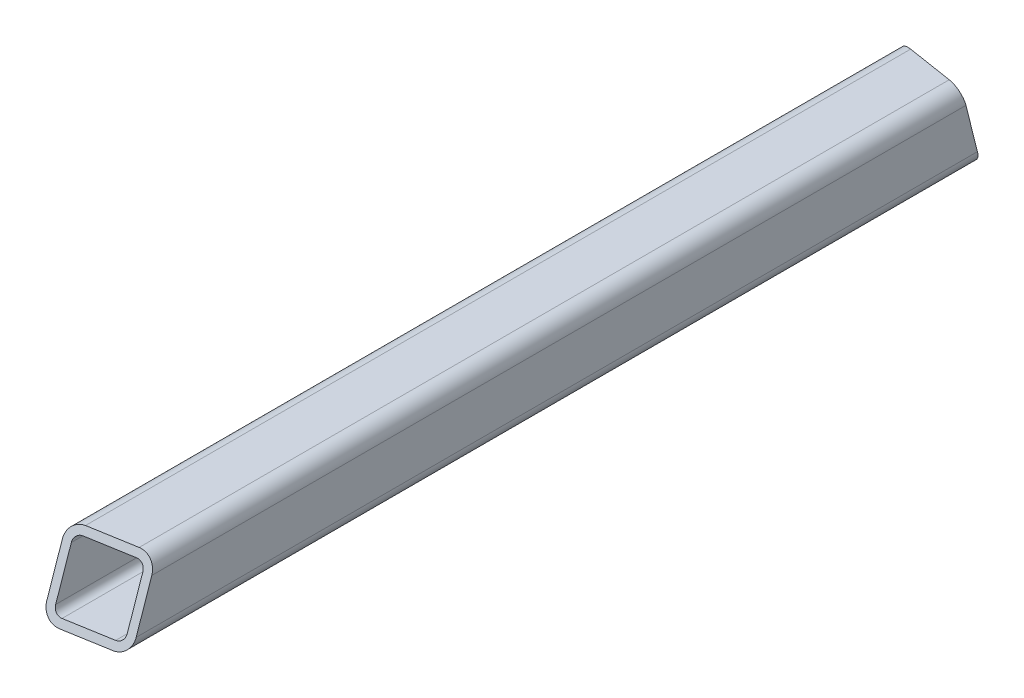
ISO-10303-21;
HEADER;
FILE_DESCRIPTION(('STEP AP214'),'2;1');
FILE_NAME('part.step','',(''),(''),'','','');
FILE_SCHEMA(('AUTOMOTIVE_DESIGN { 1 0 10303 214 1 1 1 1 }'));
ENDSEC;
DATA;
#1=APPLICATION_CONTEXT('core data for automotive mechanical design processes');
#2=APPLICATION_PROTOCOL_DEFINITION('international standard','automotive_design',2000,#1);
#3=PRODUCT_CONTEXT('',#1,'mechanical');
#4=PRODUCT('Part','Part','',(#3));
#5=PRODUCT_RELATED_PRODUCT_CATEGORY('part','',(#4));
#6=PRODUCT_DEFINITION_FORMATION('','',#4);
#7=PRODUCT_DEFINITION_CONTEXT('part definition',#1,'design');
#8=PRODUCT_DEFINITION('design','',#6,#7);
#9=PRODUCT_DEFINITION_SHAPE('','',#8);
#10=(LENGTH_UNIT() NAMED_UNIT(*) SI_UNIT(.MILLI.,.METRE.));
#11=(NAMED_UNIT(*) PLANE_ANGLE_UNIT() SI_UNIT($,.RADIAN.));
#12=(NAMED_UNIT(*) SI_UNIT($,.STERADIAN.) SOLID_ANGLE_UNIT());
#13=UNCERTAINTY_MEASURE_WITH_UNIT(LENGTH_MEASURE(1.E-05),#10,'distance_accuracy_value','');
#14=(GEOMETRIC_REPRESENTATION_CONTEXT(3) GLOBAL_UNCERTAINTY_ASSIGNED_CONTEXT((#13)) GLOBAL_UNIT_ASSIGNED_CONTEXT((#10,
#11,#12)) REPRESENTATION_CONTEXT('',''));
#15=CARTESIAN_POINT('',(0.,0.,0.));
#16=DIRECTION('',(0.,0.,1.));
#17=DIRECTION('',(1.,0.,0.));
#18=AXIS2_PLACEMENT_3D('',#15,#16,#17);
#19=CARTESIAN_POINT('',(115.999999999999,-74.0000000000005,-550.));
#20=DIRECTION('',(0.,0.,-1.));
#21=DIRECTION('',(0.,1.,0.));
#22=AXIS2_PLACEMENT_3D('',#19,#20,#21);
#23=CYLINDRICAL_SURFACE('',#22,4.);
#24=CARTESIAN_POINT('',(115.999999999999,-74.0000000000005,-767.542329532223));
#25=DIRECTION('',(0.151549664025947,0.241101738223099,-0.958594101358559));
#26=DIRECTION('',(-0.510136504157174,-0.811580802068235,-0.28477596253999));
#27=AXIS2_PLACEMENT_3D('',#24,#25,#26);
#28=ELLIPSE('',#27,4.17277760663355,4.);
#29=CARTESIAN_POINT('',(115.999999999999,-70.0000000000005,-766.536265598045));
#30=VERTEX_POINT('',#29);
#31=CARTESIAN_POINT('',(119.999999999999,-74.0000000000005,-766.909946487883));
#32=VERTEX_POINT('',#31);
#33=EDGE_CURVE('E185',#30,#32,#28,.T.);
#34=ORIENTED_EDGE('',*,*,#33,.F.);
#35=DIRECTION('',(0.,0.,-1.));
#36=VECTOR('',#35,1.);
#37=CARTESIAN_POINT('',(115.999999999999,-70.0000000000005,-550.));
#38=LINE('',#37,#36);
#39=CARTESIAN_POINT('',(115.999999999999,-70.0000000000005,-554.441330224498));
#40=VERTEX_POINT('',#39);
#41=EDGE_CURVE('E265',#40,#30,#38,.T.);
#42=ORIENTED_EDGE('',*,*,#41,.F.);
#43=CARTESIAN_POINT('',(115.999999999999,-74.0000000000005,-553.074767078499));
#44=DIRECTION('',(0.159575689721232,0.319151379442465,0.934172358962716));
#45=DIRECTION('',(0.417774579468393,0.835549158936787,-0.35682208977309));
#46=AXIS2_PLACEMENT_3D('',#43,#44,#45);
#47=ELLIPSE('',#46,4.28186507727708,4.);
#48=CARTESIAN_POINT('',(119.999999999999,-74.0000000000005,-553.758048651498));
#49=VERTEX_POINT('',#48);
#50=EDGE_CURVE('E176',#49,#40,#47,.T.);
#51=ORIENTED_EDGE('',*,*,#50,.F.);
#52=DIRECTION('',(0.,0.,-1.));
#53=VECTOR('',#52,1.);
#54=CARTESIAN_POINT('',(119.999999999999,-74.0000000000005,-550.));
#55=LINE('',#54,#53);
#56=EDGE_CURVE('E45',#49,#32,#55,.T.);
#57=ORIENTED_EDGE('',*,*,#56,.T.);
#58=EDGE_LOOP('',(#34,#42,#51,#57));
#59=FACE_BOUND('',#58,.T.);
#60=ADVANCED_FACE('F41',(#59),#23,.T.);
#61=CARTESIAN_POINT('',(115.999999999999,-70.0000000000005,-550.));
#62=DIRECTION('',(0.,-1.,0.));
#63=DIRECTION('',(0.,0.,-1.));
#64=AXIS2_PLACEMENT_3D('',#61,#62,#63);
#65=PLANE('',#64);
#66=DIRECTION('',(0.987732357643365,0.,0.156156298829986));
#67=VECTOR('',#66,1.);
#68=CARTESIAN_POINT('',(149.39868985137,-70.0000000000005,-761.256074306748));
#69=LINE('',#68,#67);
#70=CARTESIAN_POINT('',(103.999999999999,-70.0000000000005,-768.433414731066));
#71=VERTEX_POINT('',#70);
#72=EDGE_CURVE('E182',#71,#30,#69,.T.);
#73=ORIENTED_EDGE('',*,*,#72,.F.);
#74=DIRECTION('',(0.,0.,-1.));
#75=VECTOR('',#74,1.);
#76=CARTESIAN_POINT('',(103.999999999999,-70.0000000000005,-550.));
#77=LINE('',#76,#75);
#78=CARTESIAN_POINT('',(103.999999999999,-70.0000000000005,-552.391485505499));
#79=VERTEX_POINT('',#78);
#80=EDGE_CURVE('E263',#79,#71,#77,.T.);
#81=ORIENTED_EDGE('',*,*,#80,.F.);
#82=DIRECTION('',(-0.985721919281302,0.,0.168381405886714));
#83=VECTOR('',#82,1.);
#84=CARTESIAN_POINT('',(115.262840255941,-70.0000000000005,-554.31540830713));
#85=LINE('',#84,#83);
#86=EDGE_CURVE('E281',#40,#79,#85,.T.);
#87=ORIENTED_EDGE('',*,*,#86,.F.);
#88=ORIENTED_EDGE('',*,*,#41,.T.);
#89=EDGE_LOOP('',(#73,#81,#87,#88));
#90=FACE_BOUND('',#89,.T.);
#91=ADVANCED_FACE('F272',(#90),#65,.F.);
#92=CARTESIAN_POINT('',(103.999999999999,-74.0000000000005,-550.));
#93=DIRECTION('',(0.,0.,-1.));
#94=DIRECTION('',(0.,1.,0.));
#95=AXIS2_PLACEMENT_3D('',#92,#93,#94);
#96=CYLINDRICAL_SURFACE('',#95,4.);
#97=CARTESIAN_POINT('',(103.999999999999,-74.0000000000005,-769.439478665244));
#98=DIRECTION('',(0.151549664025947,0.241101738223099,-0.958594101358559));
#99=DIRECTION('',(-0.510136504157174,-0.811580802068235,-0.28477596253999));
#100=AXIS2_PLACEMENT_3D('',#97,#98,#99);
#101=ELLIPSE('',#100,4.17277760663355,4.);
#102=CARTESIAN_POINT('',(99.9999999999993,-74.0000000000005,-770.071861709584));
#103=VERTEX_POINT('',#102);
#104=EDGE_CURVE('E11',#103,#71,#101,.T.);
#105=ORIENTED_EDGE('',*,*,#104,.F.);
#106=DIRECTION('',(0.,0.,-1.));
#107=VECTOR('',#106,1.);
#108=CARTESIAN_POINT('',(99.9999999999993,-74.0000000000005,-550.));
#109=LINE('',#108,#107);
#110=CARTESIAN_POINT('',(99.9999999999993,-74.0000000000005,-550.3416407865));
#111=VERTEX_POINT('',#110);
#112=EDGE_CURVE('E260',#111,#103,#109,.T.);
#113=ORIENTED_EDGE('',*,*,#112,.F.);
#114=CARTESIAN_POINT('',(103.999999999999,-74.0000000000005,-551.024922359499));
#115=DIRECTION('',(0.159575689721232,0.319151379442465,0.934172358962716));
#116=DIRECTION('',(0.417774579468393,0.835549158936787,-0.35682208977309));
#117=AXIS2_PLACEMENT_3D('',#114,#115,#116);
#118=ELLIPSE('',#117,4.28186507727708,4.);
#119=EDGE_CURVE('E278',#79,#111,#118,.T.);
#120=ORIENTED_EDGE('',*,*,#119,.F.);
#121=ORIENTED_EDGE('',*,*,#80,.T.);
#122=EDGE_LOOP('',(#105,#113,#120,#121));
#123=FACE_BOUND('',#122,.T.);
#124=ADVANCED_FACE('F275',(#123),#96,.T.);
#125=CARTESIAN_POINT('',(99.9999999999993,-86.0000000000005,-550.));
#126=DIRECTION('',(1.,0.,0.));
#127=DIRECTION('',(0.,0.,-1.));
#128=AXIS2_PLACEMENT_3D('',#125,#126,#127);
#129=PLANE('',#128);
#130=DIRECTION('',(0.,0.969795585317006,0.243919090478066));
#131=VECTOR('',#130,1.);
#132=CARTESIAN_POINT('',(99.9999999999993,-33.2276781546823,-759.816971079269));
#133=LINE('',#132,#131);
#134=CARTESIAN_POINT('',(99.9999999999993,-86.0000000000005,-773.090053512118));
#135=VERTEX_POINT('',#134);
#136=EDGE_CURVE('E51',#135,#103,#133,.T.);
#137=ORIENTED_EDGE('',*,*,#136,.F.);
#138=DIRECTION('',(0.,0.,-1.));
#139=VECTOR('',#138,1.);
#140=CARTESIAN_POINT('',(99.9999999999993,-86.0000000000005,-550.));
#141=LINE('',#140,#139);
#142=CARTESIAN_POINT('',(99.9999999999993,-86.0000000000005,-546.241951348501));
#143=VERTEX_POINT('',#142);
#144=EDGE_CURVE('E257',#143,#135,#141,.T.);
#145=ORIENTED_EDGE('',*,*,#144,.F.);
#146=DIRECTION('',(0.,-0.946298515400179,0.32329416906498));
#147=VECTOR('',#146,1.);
#148=CARTESIAN_POINT('',(99.9999999999993,-84.8502896827349,-546.634739285539));
#149=LINE('',#148,#147);
#150=EDGE_CURVE('E280',#111,#143,#149,.T.);
#151=ORIENTED_EDGE('',*,*,#150,.F.);
#152=ORIENTED_EDGE('',*,*,#112,.T.);
#153=EDGE_LOOP('',(#137,#145,#151,#152));
#154=FACE_BOUND('',#153,.T.);
#155=ADVANCED_FACE('F291',(#154),#129,.F.);
#156=CARTESIAN_POINT('',(103.999999999999,-86.0000000000005,-550.));
#157=DIRECTION('',(0.,0.,-1.));
#158=DIRECTION('',(0.,1.,0.));
#159=AXIS2_PLACEMENT_3D('',#156,#157,#158);
#160=CYLINDRICAL_SURFACE('',#159,4.);
#161=CARTESIAN_POINT('',(103.999999999999,-86.0000000000005,-772.457670467777));
#162=DIRECTION('',(0.151549664025947,0.241101738223099,-0.958594101358559));
#163=DIRECTION('',(-0.510136504157174,-0.811580802068235,-0.28477596253999));
#164=AXIS2_PLACEMENT_3D('',#161,#162,#163);
#165=ELLIPSE('',#164,4.17277760663355,4.);
#166=CARTESIAN_POINT('',(103.999999999999,-90.0000000000005,-773.463734401955));
#167=VERTEX_POINT('',#166);
#168=EDGE_CURVE('E200',#167,#135,#165,.T.);
#169=ORIENTED_EDGE('',*,*,#168,.F.);
#170=DIRECTION('',(0.,0.,-1.));
#171=VECTOR('',#170,1.);
#172=CARTESIAN_POINT('',(103.999999999999,-90.0000000000005,-550.));
#173=LINE('',#172,#171);
#174=CARTESIAN_POINT('',(103.999999999999,-90.0000000000005,-545.558669775501));
#175=VERTEX_POINT('',#174);
#176=EDGE_CURVE('E254',#175,#167,#173,.T.);
#177=ORIENTED_EDGE('',*,*,#176,.F.);
#178=CARTESIAN_POINT('',(103.999999999999,-86.0000000000005,-546.925232921501));
#179=DIRECTION('',(0.159575689721232,0.319151379442465,0.934172358962716));
#180=DIRECTION('',(0.417774579468393,0.835549158936787,-0.35682208977309));
#181=AXIS2_PLACEMENT_3D('',#178,#179,#180);
#182=ELLIPSE('',#181,4.28186507727708,4.);
#183=EDGE_CURVE('E187',#143,#175,#182,.T.);
#184=ORIENTED_EDGE('',*,*,#183,.F.);
#185=ORIENTED_EDGE('',*,*,#144,.T.);
#186=EDGE_LOOP('',(#169,#177,#184,#185));
#187=FACE_BOUND('',#186,.T.);
#188=ADVANCED_FACE('F289',(#187),#160,.T.);
#189=CARTESIAN_POINT('',(103.999999999999,-90.0000000000005,-550.));
#190=DIRECTION('',(0.,1.,0.));
#191=DIRECTION('',(0.,0.,1.));
#192=AXIS2_PLACEMENT_3D('',#189,#190,#191);
#193=PLANE('',#192);
#194=DIRECTION('',(-0.987732357643365,0.,-0.156156298829986));
#195=VECTOR('',#194,1.);
#196=CARTESIAN_POINT('',(138.467186998478,-90.0000000000005,-768.014618240969));
#197=LINE('',#196,#195);
#198=CARTESIAN_POINT('',(115.999999999999,-90.0000000000005,-771.566585268934));
#199=VERTEX_POINT('',#198);
#200=EDGE_CURVE('E203',#199,#167,#197,.T.);
#201=ORIENTED_EDGE('',*,*,#200,.F.);
#202=DIRECTION('',(0.,0.,-1.));
#203=VECTOR('',#202,1.);
#204=CARTESIAN_POINT('',(115.999999999999,-90.0000000000005,-550.));
#205=LINE('',#204,#203);
#206=CARTESIAN_POINT('',(115.999999999999,-90.0000000000005,-547.608514494501));
#207=VERTEX_POINT('',#206);
#208=EDGE_CURVE('E252',#207,#199,#205,.T.);
#209=ORIENTED_EDGE('',*,*,#208,.F.);
#210=DIRECTION('',(0.985721919281302,0.,-0.168381405886714));
#211=VECTOR('',#210,1.);
#212=CARTESIAN_POINT('',(104.737159744057,-90.0000000000005,-545.684591692869));
#213=LINE('',#212,#211);
#214=EDGE_CURVE('E181',#175,#207,#213,.T.);
#215=ORIENTED_EDGE('',*,*,#214,.F.);
#216=ORIENTED_EDGE('',*,*,#176,.T.);
#217=EDGE_LOOP('',(#201,#209,#215,#216));
#218=FACE_BOUND('',#217,.T.);
#219=ADVANCED_FACE('F293',(#218),#193,.F.);
#220=CARTESIAN_POINT('',(115.999999999999,-86.0000000000005,-550.));
#221=DIRECTION('',(0.,0.,-1.));
#222=DIRECTION('',(0.,1.,0.));
#223=AXIS2_PLACEMENT_3D('',#220,#221,#222);
#224=CYLINDRICAL_SURFACE('',#223,4.);
#225=CARTESIAN_POINT('',(115.999999999999,-86.0000000000005,-770.560521334756));
#226=DIRECTION('',(0.151549664025947,0.241101738223099,-0.958594101358559));
#227=DIRECTION('',(-0.510136504157174,-0.811580802068235,-0.28477596253999));
#228=AXIS2_PLACEMENT_3D('',#225,#226,#227);
#229=ELLIPSE('',#228,4.17277760663355,4.);
#230=CARTESIAN_POINT('',(119.999999999999,-86.0000000000006,-769.928138290416));
#231=VERTEX_POINT('',#230);
#232=EDGE_CURVE('E164',#231,#199,#229,.T.);
#233=ORIENTED_EDGE('',*,*,#232,.F.);
#234=DIRECTION('',(0.,0.,-1.));
#235=VECTOR('',#234,1.);
#236=CARTESIAN_POINT('',(119.999999999999,-86.0000000000005,-550.));
#237=LINE('',#236,#235);
#238=CARTESIAN_POINT('',(119.999999999999,-86.0000000000005,-549.6583592135));
#239=VERTEX_POINT('',#238);
#240=EDGE_CURVE('E156',#239,#231,#237,.T.);
#241=ORIENTED_EDGE('',*,*,#240,.F.);
#242=CARTESIAN_POINT('',(115.999999999999,-86.0000000000005,-548.9750776405));
#243=DIRECTION('',(0.159575689721232,0.319151379442465,0.934172358962716));
#244=DIRECTION('',(0.417774579468393,0.835549158936787,-0.35682208977309));
#245=AXIS2_PLACEMENT_3D('',#242,#243,#244);
#246=ELLIPSE('',#245,4.28186507727708,4.);
#247=EDGE_CURVE('E161',#207,#239,#246,.T.);
#248=ORIENTED_EDGE('',*,*,#247,.F.);
#249=ORIENTED_EDGE('',*,*,#208,.T.);
#250=EDGE_LOOP('',(#233,#241,#248,#249));
#251=FACE_BOUND('',#250,.T.);
#252=ADVANCED_FACE('F158',(#251),#224,.T.);
#253=CARTESIAN_POINT('',(103.999999999999,-74.0000000000005,-550.));
#254=DIRECTION('',(0.,0.,-1.));
#255=DIRECTION('',(0.,1.,0.));
#256=AXIS2_PLACEMENT_3D('',#253,#254,#255);
#257=CYLINDRICAL_SURFACE('',#256,2.);
#258=DIRECTION('',(0.,0.,-1.));
#259=VECTOR('',#258,1.);
#260=CARTESIAN_POINT('',(101.999999999999,-74.0000000000005,-550.));
#261=LINE('',#260,#259);
#262=CARTESIAN_POINT('',(101.999999999999,-74.0000000000005,-550.683281572999));
#263=VERTEX_POINT('',#262);
#264=CARTESIAN_POINT('',(101.999999999999,-74.0000000000005,-769.755670187414));
#265=VERTEX_POINT('',#264);
#266=EDGE_CURVE('E209',#263,#265,#261,.T.);
#267=ORIENTED_EDGE('',*,*,#266,.T.);
#268=CARTESIAN_POINT('',(103.999999999999,-74.0000000000005,-769.439478665244));
#269=DIRECTION('',(0.151549664025947,0.241101738223099,-0.958594101358559));
#270=DIRECTION('',(-0.510136504157174,-0.811580802068235,-0.28477596253999));
#271=AXIS2_PLACEMENT_3D('',#268,#269,#270);
#272=ELLIPSE('',#271,2.08638880331677,2.);
#273=CARTESIAN_POINT('',(103.999999999999,-72.0000000000005,-768.936446698155));
#274=VERTEX_POINT('',#273);
#275=EDGE_CURVE('E87',#265,#274,#272,.T.);
#276=ORIENTED_EDGE('',*,*,#275,.T.);
#277=DIRECTION('',(0.,0.,-1.));
#278=VECTOR('',#277,1.);
#279=CARTESIAN_POINT('',(103.999999999999,-72.0000000000005,-550.));
#280=LINE('',#279,#278);
#281=CARTESIAN_POINT('',(103.999999999999,-72.0000000000005,-551.708203932499));
#282=VERTEX_POINT('',#281);
#283=EDGE_CURVE('E212',#282,#274,#280,.T.);
#284=ORIENTED_EDGE('',*,*,#283,.F.);
#285=CARTESIAN_POINT('',(103.999999999999,-74.0000000000005,-551.024922359499));
#286=DIRECTION('',(0.159575689721232,0.319151379442465,0.934172358962716));
#287=DIRECTION('',(0.417774579468393,0.835549158936787,-0.35682208977309));
#288=AXIS2_PLACEMENT_3D('',#285,#286,#287);
#289=ELLIPSE('',#288,2.14093253863854,2.);
#290=EDGE_CURVE('E208',#282,#263,#289,.T.);
#291=ORIENTED_EDGE('',*,*,#290,.T.);
#292=EDGE_LOOP('',(#267,#276,#284,#291));
#293=FACE_BOUND('',#292,.T.);
#294=ADVANCED_FACE('F301',(#293),#257,.F.);
#295=CARTESIAN_POINT('',(115.999999999999,-72.0000000000005,-550.));
#296=DIRECTION('',(0.,-1.,0.));
#297=DIRECTION('',(0.,0.,-1.));
#298=AXIS2_PLACEMENT_3D('',#295,#296,#297);
#299=PLANE('',#298);
#300=ORIENTED_EDGE('',*,*,#283,.T.);
#301=DIRECTION('',(0.987732357643365,0.,0.156156298829986));
#302=VECTOR('',#301,1.);
#303=CARTESIAN_POINT('',(149.476277818484,-72.0000000000005,-761.746839945125));
#304=LINE('',#303,#302);
#305=CARTESIAN_POINT('',(115.999999999999,-72.0000000000005,-767.039297565134));
#306=VERTEX_POINT('',#305);
#307=EDGE_CURVE('E60',#274,#306,#304,.T.);
#308=ORIENTED_EDGE('',*,*,#307,.T.);
#309=DIRECTION('',(0.,0.,-1.));
#310=VECTOR('',#309,1.);
#311=CARTESIAN_POINT('',(115.999999999999,-72.0000000000005,-550.));
#312=LINE('',#311,#310);
#313=CARTESIAN_POINT('',(115.999999999999,-72.0000000000005,-553.758048651498));
#314=VERTEX_POINT('',#313);
#315=EDGE_CURVE('E217',#314,#306,#312,.T.);
#316=ORIENTED_EDGE('',*,*,#315,.F.);
#317=DIRECTION('',(-0.985721919281302,0.,0.168381405886714));
#318=VECTOR('',#317,1.);
#319=CARTESIAN_POINT('',(115.376249447335,-72.0000000000005,-553.651499336802));
#320=LINE('',#319,#318);
#321=EDGE_CURVE('E211',#314,#282,#320,.T.);
#322=ORIENTED_EDGE('',*,*,#321,.T.);
#323=EDGE_LOOP('',(#300,#308,#316,#322));
#324=FACE_BOUND('',#323,.T.);
#325=ADVANCED_FACE('F349',(#324),#299,.T.);
#326=CARTESIAN_POINT('',(115.999999999999,-74.0000000000005,-550.));
#327=DIRECTION('',(0.,0.,-1.));
#328=DIRECTION('',(0.,1.,0.));
#329=AXIS2_PLACEMENT_3D('',#326,#327,#328);
#330=CYLINDRICAL_SURFACE('',#329,2.);
#331=ORIENTED_EDGE('',*,*,#315,.T.);
#332=CARTESIAN_POINT('',(115.999999999999,-74.0000000000005,-767.542329532223));
#333=DIRECTION('',(0.151549664025947,0.241101738223099,-0.958594101358559));
#334=DIRECTION('',(-0.510136504157174,-0.811580802068235,-0.28477596253999));
#335=AXIS2_PLACEMENT_3D('',#332,#333,#334);
#336=ELLIPSE('',#335,2.08638880331677,2.);
#337=CARTESIAN_POINT('',(117.999999999999,-74.0000000000004,-767.226138010053));
#338=VERTEX_POINT('',#337);
#339=EDGE_CURVE('E213',#306,#338,#336,.T.);
#340=ORIENTED_EDGE('',*,*,#339,.T.);
#341=DIRECTION('',(0.,0.,-1.));
#342=VECTOR('',#341,1.);
#343=CARTESIAN_POINT('',(117.999999999999,-74.0000000000005,-550.));
#344=LINE('',#343,#342);
#345=CARTESIAN_POINT('',(117.999999999999,-74.0000000000005,-553.416407864998));
#346=VERTEX_POINT('',#345);
#347=EDGE_CURVE('E222',#346,#338,#344,.T.);
#348=ORIENTED_EDGE('',*,*,#347,.F.);
#349=CARTESIAN_POINT('',(115.999999999999,-74.0000000000005,-553.074767078499));
#350=DIRECTION('',(0.159575689721232,0.319151379442465,0.934172358962716));
#351=DIRECTION('',(0.417774579468393,0.835549158936787,-0.35682208977309));
#352=AXIS2_PLACEMENT_3D('',#349,#350,#351);
#353=ELLIPSE('',#352,2.14093253863854,2.);
#354=EDGE_CURVE('E216',#346,#314,#353,.T.);
#355=ORIENTED_EDGE('',*,*,#354,.T.);
#356=EDGE_LOOP('',(#331,#340,#348,#355));
#357=FACE_BOUND('',#356,.T.);
#358=ADVANCED_FACE('F357',(#357),#330,.F.);
#359=CARTESIAN_POINT('',(117.999999999999,-74.0000000000005,-550.));
#360=DIRECTION('',(-1.,0.,0.));
#361=DIRECTION('',(0.,0.,1.));
#362=AXIS2_PLACEMENT_3D('',#359,#360,#361);
#363=PLANE('',#362);
#364=ORIENTED_EDGE('',*,*,#347,.T.);
#365=DIRECTION('',(0.,-0.969795585317006,-0.243919090478066));
#366=VECTOR('',#365,1.);
#367=CARTESIAN_POINT('',(117.999999999999,-22.6147970839084,-754.301938158981));
#368=LINE('',#367,#366);
#369=CARTESIAN_POINT('',(117.999999999999,-86.0000000000005,-770.244329812586));
#370=VERTEX_POINT('',#369);
#371=EDGE_CURVE('E218',#338,#370,#368,.T.);
#372=ORIENTED_EDGE('',*,*,#371,.T.);
#373=DIRECTION('',(0.,0.,-1.));
#374=VECTOR('',#373,1.);
#375=CARTESIAN_POINT('',(117.999999999999,-86.0000000000005,-550.));
#376=LINE('',#375,#374);
#377=CARTESIAN_POINT('',(117.999999999999,-86.0000000000005,-549.316718427));
#378=VERTEX_POINT('',#377);
#379=EDGE_CURVE('E227',#378,#370,#376,.T.);
#380=ORIENTED_EDGE('',*,*,#379,.F.);
#381=DIRECTION('',(0.,0.946298515400179,-0.32329416906498));
#382=VECTOR('',#381,1.);
#383=CARTESIAN_POINT('',(117.999999999999,-75.0451911975146,-553.059327922237));
#384=LINE('',#383,#382);
#385=EDGE_CURVE('E221',#378,#346,#384,.T.);
#386=ORIENTED_EDGE('',*,*,#385,.T.);
#387=EDGE_LOOP('',(#364,#372,#380,#386));
#388=FACE_BOUND('',#387,.T.);
#389=ADVANCED_FACE('F365',(#388),#363,.T.);
#390=CARTESIAN_POINT('',(115.999999999999,-86.0000000000005,-550.));
#391=DIRECTION('',(0.,0.,-1.));
#392=DIRECTION('',(0.,1.,0.));
#393=AXIS2_PLACEMENT_3D('',#390,#391,#392);
#394=CYLINDRICAL_SURFACE('',#393,2.);
#395=ORIENTED_EDGE('',*,*,#379,.T.);
#396=CARTESIAN_POINT('',(115.999999999999,-86.0000000000005,-770.560521334756));
#397=DIRECTION('',(0.151549664025947,0.241101738223099,-0.958594101358559));
#398=DIRECTION('',(-0.510136504157174,-0.811580802068235,-0.28477596253999));
#399=AXIS2_PLACEMENT_3D('',#396,#397,#398);
#400=ELLIPSE('',#399,2.08638880331677,2.);
#401=CARTESIAN_POINT('',(115.999999999999,-88.0000000000005,-771.063553301845));
#402=VERTEX_POINT('',#401);
#403=EDGE_CURVE('E223',#370,#402,#400,.T.);
#404=ORIENTED_EDGE('',*,*,#403,.T.);
#405=DIRECTION('',(0.,0.,-1.));
#406=VECTOR('',#405,1.);
#407=CARTESIAN_POINT('',(115.999999999999,-88.0000000000005,-550.));
#408=LINE('',#407,#406);
#409=CARTESIAN_POINT('',(115.999999999999,-88.0000000000005,-548.2917960675));
#410=VERTEX_POINT('',#409);
#411=EDGE_CURVE('E232',#410,#402,#408,.T.);
#412=ORIENTED_EDGE('',*,*,#411,.F.);
#413=CARTESIAN_POINT('',(115.999999999999,-86.0000000000005,-548.9750776405));
#414=DIRECTION('',(0.159575689721232,0.319151379442465,0.934172358962716));
#415=DIRECTION('',(0.417774579468393,0.835549158936787,-0.35682208977309));
#416=AXIS2_PLACEMENT_3D('',#413,#414,#415);
#417=ELLIPSE('',#416,2.14093253863854,2.);
#418=EDGE_CURVE('E226',#410,#378,#417,.T.);
#419=ORIENTED_EDGE('',*,*,#418,.T.);
#420=EDGE_LOOP('',(#395,#404,#412,#419));
#421=FACE_BOUND('',#420,.T.);
#422=ADVANCED_FACE('F373',(#421),#394,.F.);
#423=CARTESIAN_POINT('',(103.999999999999,-88.0000000000005,-550.));
#424=DIRECTION('',(0.,1.,0.));
#425=DIRECTION('',(0.,0.,1.));
#426=AXIS2_PLACEMENT_3D('',#423,#424,#425);
#427=PLANE('',#426);
#428=ORIENTED_EDGE('',*,*,#411,.T.);
#429=DIRECTION('',(-0.987732357643365,0.,-0.156156298829986));
#430=VECTOR('',#429,1.);
#431=CARTESIAN_POINT('',(138.389599031364,-88.0000000000005,-767.523852602592));
#432=LINE('',#431,#430);
#433=CARTESIAN_POINT('',(103.999999999999,-88.0000000000005,-772.960702434866));
#434=VERTEX_POINT('',#433);
#435=EDGE_CURVE('E228',#402,#434,#432,.T.);
#436=ORIENTED_EDGE('',*,*,#435,.T.);
#437=DIRECTION('',(0.,0.,-1.));
#438=VECTOR('',#437,1.);
#439=CARTESIAN_POINT('',(103.999999999999,-88.0000000000005,-550.));
#440=LINE('',#439,#438);
#441=CARTESIAN_POINT('',(103.999999999999,-88.0000000000005,-546.241951348501));
#442=VERTEX_POINT('',#441);
#443=EDGE_CURVE('E236',#442,#434,#440,.T.);
#444=ORIENTED_EDGE('',*,*,#443,.F.);
#445=DIRECTION('',(0.985721919281302,0.,-0.168381405886714));
#446=VECTOR('',#445,1.);
#447=CARTESIAN_POINT('',(104.623750552664,-88.0000000000005,-546.348500663197));
#448=LINE('',#447,#446);
#449=EDGE_CURVE('E231',#442,#410,#448,.T.);
#450=ORIENTED_EDGE('',*,*,#449,.T.);
#451=EDGE_LOOP('',(#428,#436,#444,#450));
#452=FACE_BOUND('',#451,.T.);
#453=ADVANCED_FACE('F381',(#452),#427,.T.);
#454=CARTESIAN_POINT('',(103.999999999999,-86.0000000000005,-550.));
#455=DIRECTION('',(0.,0.,-1.));
#456=DIRECTION('',(0.,1.,0.));
#457=AXIS2_PLACEMENT_3D('',#454,#455,#456);
#458=CYLINDRICAL_SURFACE('',#457,2.);
#459=ORIENTED_EDGE('',*,*,#443,.T.);
#460=CARTESIAN_POINT('',(103.999999999999,-86.0000000000005,-772.457670467777));
#461=DIRECTION('',(0.151549664025947,0.241101738223099,-0.958594101358559));
#462=DIRECTION('',(-0.510136504157174,-0.811580802068235,-0.28477596253999));
#463=AXIS2_PLACEMENT_3D('',#460,#461,#462);
#464=ELLIPSE('',#463,2.08638880331677,2.);
#465=CARTESIAN_POINT('',(101.999999999999,-86.0000000000006,-772.773861989948));
#466=VERTEX_POINT('',#465);
#467=EDGE_CURVE('E233',#434,#466,#464,.T.);
#468=ORIENTED_EDGE('',*,*,#467,.T.);
#469=DIRECTION('',(0.,0.,-1.));
#470=VECTOR('',#469,1.);
#471=CARTESIAN_POINT('',(101.999999999999,-86.0000000000005,-550.));
#472=LINE('',#471,#470);
#473=CARTESIAN_POINT('',(101.999999999999,-86.0000000000005,-546.583592135001));
#474=VERTEX_POINT('',#473);
#475=EDGE_CURVE('E194',#474,#466,#472,.T.);
#476=ORIENTED_EDGE('',*,*,#475,.F.);
#477=CARTESIAN_POINT('',(103.999999999999,-86.0000000000005,-546.925232921501));
#478=DIRECTION('',(0.159575689721232,0.319151379442465,0.934172358962716));
#479=DIRECTION('',(0.417774579468393,0.835549158936787,-0.35682208977309));
#480=AXIS2_PLACEMENT_3D('',#477,#478,#479);
#481=ELLIPSE('',#480,2.14093253863854,2.);
#482=EDGE_CURVE('E235',#474,#442,#481,.T.);
#483=ORIENTED_EDGE('',*,*,#482,.T.);
#484=EDGE_LOOP('',(#459,#468,#476,#483));
#485=FACE_BOUND('',#484,.T.);
#486=ADVANCED_FACE('F389',(#485),#458,.F.);
#487=CARTESIAN_POINT('',(101.999999999999,-86.0000000000005,-550.));
#488=DIRECTION('',(1.,0.,0.));
#489=DIRECTION('',(0.,0.,-1.));
#490=AXIS2_PLACEMENT_3D('',#487,#488,#489);
#491=PLANE('',#490);
#492=ORIENTED_EDGE('',*,*,#475,.T.);
#493=DIRECTION('',(0.,0.969795585317006,0.243919090478066));
#494=VECTOR('',#493,1.);
#495=CARTESIAN_POINT('',(101.999999999999,-33.302473783219,-759.519591853175));
#496=LINE('',#495,#494);
#497=EDGE_CURVE('E82',#466,#265,#496,.T.);
#498=ORIENTED_EDGE('',*,*,#497,.T.);
#499=ORIENTED_EDGE('',*,*,#266,.F.);
#500=DIRECTION('',(0.,-0.946298515400179,0.32329416906498));
#501=VECTOR('',#500,1.);
#502=CARTESIAN_POINT('',(101.999999999999,-84.9548088024863,-546.940672077763));
#503=LINE('',#502,#501);
#504=EDGE_CURVE('E169',#263,#474,#503,.T.);
#505=ORIENTED_EDGE('',*,*,#504,.T.);
#506=EDGE_LOOP('',(#492,#498,#499,#505));
#507=FACE_BOUND('',#506,.T.);
#508=ADVANCED_FACE('F397',(#507),#491,.T.);
#509=CARTESIAN_POINT('',(119.999999999999,-74.0000000000005,-550.));
#510=DIRECTION('',(-1.,0.,0.));
#511=DIRECTION('',(0.,0.,1.));
#512=AXIS2_PLACEMENT_3D('',#509,#510,#511);
#513=PLANE('',#512);
#514=DIRECTION('',(0.,-0.969795585317006,-0.243919090478066));
#515=VECTOR('',#514,1.);
#516=CARTESIAN_POINT('',(119.999999999999,-22.6895927124451,-754.004558932887));
#517=LINE('',#516,#515);
#518=EDGE_CURVE('E196',#32,#231,#517,.T.);
#519=ORIENTED_EDGE('',*,*,#518,.F.);
#520=ORIENTED_EDGE('',*,*,#56,.F.);
#521=DIRECTION('',(0.,0.946298515400179,-0.32329416906498));
#522=VECTOR('',#521,1.);
#523=CARTESIAN_POINT('',(119.999999999999,-75.149710317266,-553.365260714461));
#524=LINE('',#523,#522);
#525=EDGE_CURVE('E168',#239,#49,#524,.T.);
#526=ORIENTED_EDGE('',*,*,#525,.F.);
#527=ORIENTED_EDGE('',*,*,#240,.T.);
#528=EDGE_LOOP('',(#519,#520,#526,#527));
#529=FACE_BOUND('',#528,.T.);
#530=ADVANCED_FACE('F172',(#529),#513,.F.);
#531=CARTESIAN_POINT('',(110.,-80.,-550.));
#532=DIRECTION('',(0.159575689721232,0.319151379442465,0.934172358962716));
#533=DIRECTION('',(0.,-0.946298515400179,0.32329416906498));
#534=AXIS2_PLACEMENT_3D('',#531,#532,#533);
#535=PLANE('',#534);
#536=ORIENTED_EDGE('',*,*,#290,.F.);
#537=ORIENTED_EDGE('',*,*,#321,.F.);
#538=ORIENTED_EDGE('',*,*,#354,.F.);
#539=ORIENTED_EDGE('',*,*,#385,.F.);
#540=ORIENTED_EDGE('',*,*,#418,.F.);
#541=ORIENTED_EDGE('',*,*,#449,.F.);
#542=ORIENTED_EDGE('',*,*,#482,.F.);
#543=ORIENTED_EDGE('',*,*,#504,.F.);
#544=EDGE_LOOP('',(#536,#537,#538,#539,#540,#541,#542,#543));
#545=FACE_BOUND('',#544,.T.);
#546=ORIENTED_EDGE('',*,*,#525,.T.);
#547=ORIENTED_EDGE('',*,*,#50,.T.);
#548=ORIENTED_EDGE('',*,*,#86,.T.);
#549=ORIENTED_EDGE('',*,*,#119,.T.);
#550=ORIENTED_EDGE('',*,*,#150,.T.);
#551=ORIENTED_EDGE('',*,*,#183,.T.);
#552=ORIENTED_EDGE('',*,*,#214,.T.);
#553=ORIENTED_EDGE('',*,*,#247,.T.);
#554=EDGE_LOOP('',(#546,#547,#548,#549,#550,#551,#552,#553));
#555=FACE_BOUND('',#554,.T.);
#556=ADVANCED_FACE('F179',(#545,#555),#535,.T.);
#557=CARTESIAN_POINT('',(110.,-80.,-770.));
#558=DIRECTION('',(0.151549664025947,0.241101738223099,-0.958594101358559));
#559=DIRECTION('',(0.,0.969795585317006,0.243919090478066));
#560=AXIS2_PLACEMENT_3D('',#557,#558,#559);
#561=PLANE('',#560);
#562=ORIENTED_EDGE('',*,*,#275,.F.);
#563=ORIENTED_EDGE('',*,*,#497,.F.);
#564=ORIENTED_EDGE('',*,*,#467,.F.);
#565=ORIENTED_EDGE('',*,*,#435,.F.);
#566=ORIENTED_EDGE('',*,*,#403,.F.);
#567=ORIENTED_EDGE('',*,*,#371,.F.);
#568=ORIENTED_EDGE('',*,*,#339,.F.);
#569=ORIENTED_EDGE('',*,*,#307,.F.);
#570=EDGE_LOOP('',(#562,#563,#564,#565,#566,#567,#568,#569));
#571=FACE_BOUND('',#570,.T.);
#572=ORIENTED_EDGE('',*,*,#72,.T.);
#573=ORIENTED_EDGE('',*,*,#33,.T.);
#574=ORIENTED_EDGE('',*,*,#518,.T.);
#575=ORIENTED_EDGE('',*,*,#232,.T.);
#576=ORIENTED_EDGE('',*,*,#200,.T.);
#577=ORIENTED_EDGE('',*,*,#168,.T.);
#578=ORIENTED_EDGE('',*,*,#136,.T.);
#579=ORIENTED_EDGE('',*,*,#104,.T.);
#580=EDGE_LOOP('',(#572,#573,#574,#575,#576,#577,#578,#579));
#581=FACE_BOUND('',#580,.T.);
#582=ADVANCED_FACE('F43',(#571,#581),#561,.T.);
#583=CLOSED_SHELL('',(#60,#91,#124,#155,#188,#219,#252,#294,#325,#358,#389,#422,#453,#486,#508,
#530,#556,#582));
#584=MANIFOLD_SOLID_BREP('B2',#583);
#585=ADVANCED_BREP_SHAPE_REPRESENTATION('',(#18,#584),#14);
#586=SHAPE_DEFINITION_REPRESENTATION(#9,#585);
ENDSEC;
END-ISO-10303-21;
